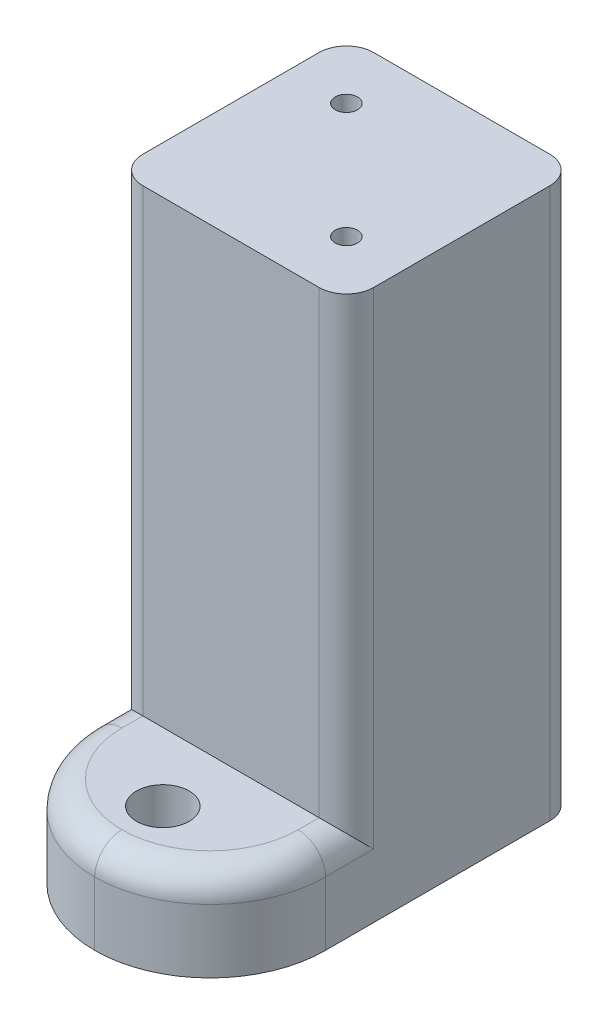
ISO-10303-21;
HEADER;
FILE_DESCRIPTION(('STEP AP214'),'2;1');
FILE_NAME('part.step','',(''),(''),'','','');
FILE_SCHEMA(('AUTOMOTIVE_DESIGN { 1 0 10303 214 1 1 1 1 }'));
ENDSEC;
DATA;
#1=APPLICATION_CONTEXT('core data for automotive mechanical design processes');
#2=APPLICATION_PROTOCOL_DEFINITION('international standard','automotive_design',2000,#1);
#3=PRODUCT_CONTEXT('',#1,'mechanical');
#4=PRODUCT('Part','Part','',(#3));
#5=PRODUCT_RELATED_PRODUCT_CATEGORY('part','',(#4));
#6=PRODUCT_DEFINITION_FORMATION('','',#4);
#7=PRODUCT_DEFINITION_CONTEXT('part definition',#1,'design');
#8=PRODUCT_DEFINITION('design','',#6,#7);
#9=PRODUCT_DEFINITION_SHAPE('','',#8);
#10=(LENGTH_UNIT() NAMED_UNIT(*) SI_UNIT(.MILLI.,.METRE.));
#11=(NAMED_UNIT(*) PLANE_ANGLE_UNIT() SI_UNIT($,.RADIAN.));
#12=(NAMED_UNIT(*) SI_UNIT($,.STERADIAN.) SOLID_ANGLE_UNIT());
#13=UNCERTAINTY_MEASURE_WITH_UNIT(LENGTH_MEASURE(1.E-05),#10,'distance_accuracy_value','');
#14=(GEOMETRIC_REPRESENTATION_CONTEXT(3) GLOBAL_UNCERTAINTY_ASSIGNED_CONTEXT((#13)) GLOBAL_UNIT_ASSIGNED_CONTEXT((#10,
#11,#12)) REPRESENTATION_CONTEXT('',''));
#15=CARTESIAN_POINT('',(0.,0.,0.));
#16=DIRECTION('',(0.,0.,1.));
#17=DIRECTION('',(1.,0.,0.));
#18=AXIS2_PLACEMENT_3D('',#15,#16,#17);
#19=CARTESIAN_POINT('',(0.,10.,0.));
#20=DIRECTION('',(0.,1.,0.));
#21=DIRECTION('',(0.,0.,1.));
#22=AXIS2_PLACEMENT_3D('',#19,#20,#21);
#23=PLANE('',#22);
#24=CARTESIAN_POINT('',(0.,10.,-7.5));
#25=DIRECTION('',(0.,1.,0.));
#26=DIRECTION('',(0.,0.,1.));
#27=AXIS2_PLACEMENT_3D('',#24,#25,#26);
#28=CIRCLE('',#27,2.9);
#29=CARTESIAN_POINT('',(0.,10.,-4.6));
#30=VERTEX_POINT('',#29);
#31=EDGE_CURVE('E205',#30,#30,#28,.T.);
#32=ORIENTED_EDGE('',*,*,#31,.F.);
#33=EDGE_LOOP('',(#32));
#34=FACE_BOUND('',#33,.T.);
#35=CARTESIAN_POINT('',(0.,10.,-12.7));
#36=DIRECTION('',(0.,1.,0.));
#37=DIRECTION('',(0.,0.,1.));
#38=AXIS2_PLACEMENT_3D('',#35,#36,#37);
#39=CIRCLE('',#38,9.7);
#40=CARTESIAN_POINT('',(0.,10.,-3.));
#41=VERTEX_POINT('',#40);
#42=CARTESIAN_POINT('',(-9.7,10.,-12.7));
#43=VERTEX_POINT('',#42);
#44=EDGE_CURVE('E208',#41,#43,#39,.F.);
#45=ORIENTED_EDGE('',*,*,#44,.F.);
#46=CARTESIAN_POINT('',(0.,10.,-12.7));
#47=DIRECTION('',(0.,1.,0.));
#48=DIRECTION('',(0.,0.,1.));
#49=AXIS2_PLACEMENT_3D('',#46,#47,#48);
#50=CIRCLE('',#49,9.7);
#51=CARTESIAN_POINT('',(9.7,10.,-12.7));
#52=VERTEX_POINT('',#51);
#53=EDGE_CURVE('E201',#52,#41,#50,.F.);
#54=ORIENTED_EDGE('',*,*,#53,.F.);
#55=DIRECTION('',(0.,0.,-1.));
#56=VECTOR('',#55,1.);
#57=CARTESIAN_POINT('',(9.7,10.,-15.));
#58=LINE('',#57,#56);
#59=CARTESIAN_POINT('',(9.7,10.,-15.));
#60=VERTEX_POINT('',#59);
#61=EDGE_CURVE('E150',#52,#60,#58,.T.);
#62=ORIENTED_EDGE('',*,*,#61,.T.);
#63=DIRECTION('',(1.,0.,0.));
#64=VECTOR('',#63,1.);
#65=CARTESIAN_POINT('',(-12.7,10.,-15.));
#66=LINE('',#65,#64);
#67=CARTESIAN_POINT('',(-9.7,10.,-15.));
#68=VERTEX_POINT('',#67);
#69=EDGE_CURVE('E133',#68,#60,#66,.T.);
#70=ORIENTED_EDGE('',*,*,#69,.F.);
#71=DIRECTION('',(0.,0.,1.));
#72=VECTOR('',#71,1.);
#73=CARTESIAN_POINT('',(-9.70000000000001,10.,0.));
#74=LINE('',#73,#72);
#75=EDGE_CURVE('E147',#68,#43,#74,.T.);
#76=ORIENTED_EDGE('',*,*,#75,.T.);
#77=EDGE_LOOP('',(#45,#54,#62,#70,#76));
#78=FACE_BOUND('',#77,.T.);
#79=ADVANCED_FACE('F35',(#34,#78),#23,.T.);
#80=CARTESIAN_POINT('',(-12.7,10.,-40.4));
#81=DIRECTION('',(1.,0.,0.));
#82=DIRECTION('',(0.,0.,-1.));
#83=AXIS2_PLACEMENT_3D('',#80,#81,#82);
#84=PLANE('',#83);
#85=DIRECTION('',(0.,0.,1.));
#86=VECTOR('',#85,1.);
#87=CARTESIAN_POINT('',(-12.7,0.,-40.4));
#88=LINE('',#87,#86);
#89=CARTESIAN_POINT('',(-12.7,0.,-37.4));
#90=VERTEX_POINT('',#89);
#91=CARTESIAN_POINT('',(-12.7,0.,-12.7));
#92=VERTEX_POINT('',#91);
#93=EDGE_CURVE('E254',#90,#92,#88,.T.);
#94=ORIENTED_EDGE('',*,*,#93,.T.);
#95=DIRECTION('',(0.,-1.,0.));
#96=VECTOR('',#95,1.);
#97=CARTESIAN_POINT('',(-12.7,10.,-12.7));
#98=LINE('',#97,#96);
#99=CARTESIAN_POINT('',(-12.7,7.,-12.7));
#100=VERTEX_POINT('',#99);
#101=EDGE_CURVE('E44',#92,#100,#98,.F.);
#102=ORIENTED_EDGE('',*,*,#101,.T.);
#103=DIRECTION('',(0.,0.,1.));
#104=VECTOR('',#103,1.);
#105=CARTESIAN_POINT('',(-12.7,7.,-15.));
#106=LINE('',#105,#104);
#107=CARTESIAN_POINT('',(-12.7,7.,-18.));
#108=VERTEX_POINT('',#107);
#109=EDGE_CURVE('E167',#100,#108,#106,.F.);
#110=ORIENTED_EDGE('',*,*,#109,.T.);
#111=DIRECTION('',(0.,-1.,0.));
#112=VECTOR('',#111,1.);
#113=CARTESIAN_POINT('',(-12.7,10.,-18.));
#114=LINE('',#113,#112);
#115=CARTESIAN_POINT('',(-12.7,60.54,-18.));
#116=VERTEX_POINT('',#115);
#117=EDGE_CURVE('E158',#108,#116,#114,.F.);
#118=ORIENTED_EDGE('',*,*,#117,.T.);
#119=DIRECTION('',(0.,0.,1.));
#120=VECTOR('',#119,1.);
#121=CARTESIAN_POINT('',(-12.7,60.54,-40.4));
#122=LINE('',#121,#120);
#123=CARTESIAN_POINT('',(-12.7,60.54,-37.4));
#124=VERTEX_POINT('',#123);
#125=EDGE_CURVE('E151',#124,#116,#122,.T.);
#126=ORIENTED_EDGE('',*,*,#125,.F.);
#127=DIRECTION('',(0.,-1.,0.));
#128=VECTOR('',#127,1.);
#129=CARTESIAN_POINT('',(-12.7,10.,-37.4));
#130=LINE('',#129,#128);
#131=EDGE_CURVE('E174',#124,#90,#130,.T.);
#132=ORIENTED_EDGE('',*,*,#131,.T.);
#133=EDGE_LOOP('',(#94,#102,#110,#118,#126,#132));
#134=FACE_BOUND('',#133,.T.);
#135=ADVANCED_FACE('F271',(#134),#84,.F.);
#136=CARTESIAN_POINT('',(12.7,10.,-40.4));
#137=DIRECTION('',(-1.,0.,0.));
#138=DIRECTION('',(0.,0.,1.));
#139=AXIS2_PLACEMENT_3D('',#136,#137,#138);
#140=PLANE('',#139);
#141=DIRECTION('',(0.,0.,-1.));
#142=VECTOR('',#141,1.);
#143=CARTESIAN_POINT('',(12.7,7.,0.));
#144=LINE('',#143,#142);
#145=CARTESIAN_POINT('',(12.7,7.,-18.));
#146=VERTEX_POINT('',#145);
#147=CARTESIAN_POINT('',(12.7,7.,-12.7));
#148=VERTEX_POINT('',#147);
#149=EDGE_CURVE('E179',#146,#148,#144,.F.);
#150=ORIENTED_EDGE('',*,*,#149,.T.);
#151=DIRECTION('',(0.,-1.,0.));
#152=VECTOR('',#151,1.);
#153=CARTESIAN_POINT('',(12.7,10.,-12.7));
#154=LINE('',#153,#152);
#155=CARTESIAN_POINT('',(12.7,0.,-12.7));
#156=VERTEX_POINT('',#155);
#157=EDGE_CURVE('E213',#148,#156,#154,.T.);
#158=ORIENTED_EDGE('',*,*,#157,.T.);
#159=DIRECTION('',(0.,0.,-1.));
#160=VECTOR('',#159,1.);
#161=CARTESIAN_POINT('',(12.7,0.,-40.4));
#162=LINE('',#161,#160);
#163=CARTESIAN_POINT('',(12.7,0.,-37.4));
#164=VERTEX_POINT('',#163);
#165=EDGE_CURVE('E257',#156,#164,#162,.T.);
#166=ORIENTED_EDGE('',*,*,#165,.T.);
#167=DIRECTION('',(0.,-1.,0.));
#168=VECTOR('',#167,1.);
#169=CARTESIAN_POINT('',(12.7,10.,-37.4));
#170=LINE('',#169,#168);
#171=CARTESIAN_POINT('',(12.7,60.54,-37.4));
#172=VERTEX_POINT('',#171);
#173=EDGE_CURVE('E182',#164,#172,#170,.F.);
#174=ORIENTED_EDGE('',*,*,#173,.T.);
#175=DIRECTION('',(0.,0.,-1.));
#176=VECTOR('',#175,1.);
#177=CARTESIAN_POINT('',(12.7,60.54,-40.4));
#178=LINE('',#177,#176);
#179=CARTESIAN_POINT('',(12.7,60.54,-18.));
#180=VERTEX_POINT('',#179);
#181=EDGE_CURVE('E247',#180,#172,#178,.T.);
#182=ORIENTED_EDGE('',*,*,#181,.F.);
#183=DIRECTION('',(0.,-1.,0.));
#184=VECTOR('',#183,1.);
#185=CARTESIAN_POINT('',(12.7,10.,-18.));
#186=LINE('',#185,#184);
#187=EDGE_CURVE('E177',#180,#146,#186,.T.);
#188=ORIENTED_EDGE('',*,*,#187,.T.);
#189=EDGE_LOOP('',(#150,#158,#166,#174,#182,#188));
#190=FACE_BOUND('',#189,.T.);
#191=ADVANCED_FACE('F288',(#190),#140,.F.);
#192=CARTESIAN_POINT('',(-12.7,10.,-40.4));
#193=DIRECTION('',(0.,0.,1.));
#194=DIRECTION('',(1.,0.,0.));
#195=AXIS2_PLACEMENT_3D('',#192,#193,#194);
#196=PLANE('',#195);
#197=DIRECTION('',(-1.,0.,0.));
#198=VECTOR('',#197,1.);
#199=CARTESIAN_POINT('',(-12.7,0.,-40.4));
#200=LINE('',#199,#198);
#201=CARTESIAN_POINT('',(9.7,0.,-40.4));
#202=VERTEX_POINT('',#201);
#203=CARTESIAN_POINT('',(-9.7,0.,-40.4));
#204=VERTEX_POINT('',#203);
#205=EDGE_CURVE('E169',#202,#204,#200,.T.);
#206=ORIENTED_EDGE('',*,*,#205,.T.);
#207=DIRECTION('',(0.,-1.,0.));
#208=VECTOR('',#207,1.);
#209=CARTESIAN_POINT('',(-9.7,10.,-40.4));
#210=LINE('',#209,#208);
#211=CARTESIAN_POINT('',(-9.7,60.54,-40.4));
#212=VERTEX_POINT('',#211);
#213=EDGE_CURVE('E192',#204,#212,#210,.F.);
#214=ORIENTED_EDGE('',*,*,#213,.T.);
#215=DIRECTION('',(-1.,0.,0.));
#216=VECTOR('',#215,1.);
#217=CARTESIAN_POINT('',(-12.7,60.54,-40.4));
#218=LINE('',#217,#216);
#219=CARTESIAN_POINT('',(9.7,60.54,-40.4));
#220=VERTEX_POINT('',#219);
#221=EDGE_CURVE('E249',#220,#212,#218,.T.);
#222=ORIENTED_EDGE('',*,*,#221,.F.);
#223=DIRECTION('',(0.,-1.,0.));
#224=VECTOR('',#223,1.);
#225=CARTESIAN_POINT('',(9.7,10.,-40.4));
#226=LINE('',#225,#224);
#227=EDGE_CURVE('E189',#220,#202,#226,.T.);
#228=ORIENTED_EDGE('',*,*,#227,.T.);
#229=EDGE_LOOP('',(#206,#214,#222,#228));
#230=FACE_BOUND('',#229,.T.);
#231=ADVANCED_FACE('F262',(#230),#196,.F.);
#232=CARTESIAN_POINT('',(0.,0.,0.));
#233=DIRECTION('',(0.,1.,0.));
#234=DIRECTION('',(0.,0.,1.));
#235=AXIS2_PLACEMENT_3D('',#232,#233,#234);
#236=PLANE('',#235);
#237=CARTESIAN_POINT('',(0.,0.,-7.5));
#238=DIRECTION('',(0.,1.,0.));
#239=DIRECTION('',(0.,0.,1.));
#240=AXIS2_PLACEMENT_3D('',#237,#238,#239);
#241=CIRCLE('',#240,2.9);
#242=CARTESIAN_POINT('',(0.,0.,-4.6));
#243=VERTEX_POINT('',#242);
#244=EDGE_CURVE('E486',#243,#243,#241,.T.);
#245=ORIENTED_EDGE('',*,*,#244,.T.);
#246=EDGE_LOOP('',(#245));
#247=FACE_BOUND('',#246,.T.);
#248=ORIENTED_EDGE('',*,*,#165,.F.);
#249=CARTESIAN_POINT('',(0.,0.,-12.7));
#250=DIRECTION('',(0.,1.,0.));
#251=DIRECTION('',(0.,0.,1.));
#252=AXIS2_PLACEMENT_3D('',#249,#250,#251);
#253=CIRCLE('',#252,12.7);
#254=CARTESIAN_POINT('',(0.,0.,0.));
#255=VERTEX_POINT('',#254);
#256=EDGE_CURVE('E52',#156,#255,#253,.F.);
#257=ORIENTED_EDGE('',*,*,#256,.T.);
#258=CARTESIAN_POINT('',(0.,0.,-12.7));
#259=DIRECTION('',(0.,1.,0.));
#260=DIRECTION('',(0.,0.,1.));
#261=AXIS2_PLACEMENT_3D('',#258,#259,#260);
#262=CIRCLE('',#261,12.7);
#263=EDGE_CURVE('E57',#255,#92,#262,.F.);
#264=ORIENTED_EDGE('',*,*,#263,.T.);
#265=ORIENTED_EDGE('',*,*,#93,.F.);
#266=CARTESIAN_POINT('',(-9.7,0.,-37.4));
#267=DIRECTION('',(0.,1.,0.));
#268=DIRECTION('',(0.,0.,1.));
#269=AXIS2_PLACEMENT_3D('',#266,#267,#268);
#270=CIRCLE('',#269,3.);
#271=EDGE_CURVE('E187',#90,#204,#270,.F.);
#272=ORIENTED_EDGE('',*,*,#271,.T.);
#273=ORIENTED_EDGE('',*,*,#205,.F.);
#274=CARTESIAN_POINT('',(9.7,0.,-37.4));
#275=DIRECTION('',(0.,1.,0.));
#276=DIRECTION('',(0.,0.,1.));
#277=AXIS2_PLACEMENT_3D('',#274,#275,#276);
#278=CIRCLE('',#277,3.);
#279=EDGE_CURVE('E184',#202,#164,#278,.F.);
#280=ORIENTED_EDGE('',*,*,#279,.T.);
#281=EDGE_LOOP('',(#248,#257,#264,#265,#272,#273,#280));
#282=FACE_BOUND('',#281,.T.);
#283=ADVANCED_FACE('F294',(#247,#282),#236,.F.);
#284=CARTESIAN_POINT('',(-12.7,60.54,-15.));
#285=DIRECTION('',(0.,0.,-1.));
#286=DIRECTION('',(-1.,0.,0.));
#287=AXIS2_PLACEMENT_3D('',#284,#285,#286);
#288=PLANE('',#287);
#289=ORIENTED_EDGE('',*,*,#69,.T.);
#290=DIRECTION('',(0.,-1.,0.));
#291=VECTOR('',#290,1.);
#292=CARTESIAN_POINT('',(9.7,60.54,-15.));
#293=LINE('',#292,#291);
#294=CARTESIAN_POINT('',(9.7,60.54,-15.));
#295=VERTEX_POINT('',#294);
#296=EDGE_CURVE('E140',#60,#295,#293,.F.);
#297=ORIENTED_EDGE('',*,*,#296,.T.);
#298=DIRECTION('',(1.,0.,0.));
#299=VECTOR('',#298,1.);
#300=CARTESIAN_POINT('',(-12.7,60.54,-15.));
#301=LINE('',#300,#299);
#302=CARTESIAN_POINT('',(-9.7,60.54,-15.));
#303=VERTEX_POINT('',#302);
#304=EDGE_CURVE('E136',#303,#295,#301,.T.);
#305=ORIENTED_EDGE('',*,*,#304,.F.);
#306=DIRECTION('',(0.,-1.,0.));
#307=VECTOR('',#306,1.);
#308=CARTESIAN_POINT('',(-9.7,60.54,-15.));
#309=LINE('',#308,#307);
#310=EDGE_CURVE('E130',#303,#68,#309,.T.);
#311=ORIENTED_EDGE('',*,*,#310,.T.);
#312=EDGE_LOOP('',(#289,#297,#305,#311));
#313=FACE_BOUND('',#312,.T.);
#314=ADVANCED_FACE('F132',(#313),#288,.F.);
#315=CARTESIAN_POINT('',(0.,60.54,0.));
#316=DIRECTION('',(0.,1.,0.));
#317=DIRECTION('',(0.,0.,1.));
#318=AXIS2_PLACEMENT_3D('',#315,#316,#317);
#319=PLANE('',#318);
#320=CARTESIAN_POINT('',(-6.35,60.54,-34.05));
#321=DIRECTION('',(0.,1.,0.));
#322=DIRECTION('',(0.,0.,1.));
#323=AXIS2_PLACEMENT_3D('',#320,#321,#322);
#324=CIRCLE('',#323,1.2303);
#325=CARTESIAN_POINT('',(-6.35,60.54,-32.8197));
#326=VERTEX_POINT('',#325);
#327=EDGE_CURVE('E480',#326,#326,#324,.T.);
#328=ORIENTED_EDGE('',*,*,#327,.F.);
#329=EDGE_LOOP('',(#328));
#330=FACE_BOUND('',#329,.T.);
#331=CARTESIAN_POINT('',(6.35,60.54,-21.35));
#332=DIRECTION('',(0.,1.,0.));
#333=DIRECTION('',(0.,0.,1.));
#334=AXIS2_PLACEMENT_3D('',#331,#332,#333);
#335=CIRCLE('',#334,1.2303);
#336=CARTESIAN_POINT('',(6.35,60.54,-20.1197));
#337=VERTEX_POINT('',#336);
#338=EDGE_CURVE('E483',#337,#337,#335,.T.);
#339=ORIENTED_EDGE('',*,*,#338,.F.);
#340=EDGE_LOOP('',(#339));
#341=FACE_BOUND('',#340,.T.);
#342=ORIENTED_EDGE('',*,*,#221,.T.);
#343=CARTESIAN_POINT('',(-9.7,60.54,-37.4));
#344=DIRECTION('',(0.,1.,0.));
#345=DIRECTION('',(0.,0.,1.));
#346=AXIS2_PLACEMENT_3D('',#343,#344,#345);
#347=CIRCLE('',#346,3.);
#348=EDGE_CURVE('E141',#212,#124,#347,.T.);
#349=ORIENTED_EDGE('',*,*,#348,.T.);
#350=ORIENTED_EDGE('',*,*,#125,.T.);
#351=CARTESIAN_POINT('',(-9.7,60.54,-18.));
#352=DIRECTION('',(0.,1.,0.));
#353=DIRECTION('',(0.,0.,1.));
#354=AXIS2_PLACEMENT_3D('',#351,#352,#353);
#355=CIRCLE('',#354,3.);
#356=EDGE_CURVE('E194',#116,#303,#355,.T.);
#357=ORIENTED_EDGE('',*,*,#356,.T.);
#358=ORIENTED_EDGE('',*,*,#304,.T.);
#359=CARTESIAN_POINT('',(9.7,60.54,-18.));
#360=DIRECTION('',(0.,1.,0.));
#361=DIRECTION('',(0.,0.,1.));
#362=AXIS2_PLACEMENT_3D('',#359,#360,#361);
#363=CIRCLE('',#362,3.);
#364=EDGE_CURVE('E196',#295,#180,#363,.T.);
#365=ORIENTED_EDGE('',*,*,#364,.T.);
#366=ORIENTED_EDGE('',*,*,#181,.T.);
#367=CARTESIAN_POINT('',(9.7,60.54,-37.4));
#368=DIRECTION('',(0.,1.,0.));
#369=DIRECTION('',(0.,0.,1.));
#370=AXIS2_PLACEMENT_3D('',#367,#368,#369);
#371=CIRCLE('',#370,3.);
#372=EDGE_CURVE('E198',#172,#220,#371,.T.);
#373=ORIENTED_EDGE('',*,*,#372,.T.);
#374=EDGE_LOOP('',(#342,#349,#350,#357,#358,#365,#366,#373));
#375=FACE_BOUND('',#374,.T.);
#376=ADVANCED_FACE('F243',(#330,#341,#375),#319,.T.);
#377=CARTESIAN_POINT('',(6.35,40.54,-21.35));
#378=DIRECTION('',(0.,1.,0.));
#379=DIRECTION('',(0.,0.,1.));
#380=AXIS2_PLACEMENT_3D('',#377,#378,#379);
#381=CYLINDRICAL_SURFACE('',#380,1.2303);
#382=CARTESIAN_POINT('',(6.35,40.54,-21.35));
#383=DIRECTION('',(0.,1.,0.));
#384=DIRECTION('',(0.,0.,1.));
#385=AXIS2_PLACEMENT_3D('',#382,#383,#384);
#386=CIRCLE('',#385,1.2303);
#387=CARTESIAN_POINT('',(6.35,40.54,-20.1197));
#388=VERTEX_POINT('',#387);
#389=EDGE_CURVE('E485',#388,#388,#386,.T.);
#390=ORIENTED_EDGE('',*,*,#389,.F.);
#391=EDGE_LOOP('',(#390));
#392=FACE_BOUND('',#391,.T.);
#393=ORIENTED_EDGE('',*,*,#338,.T.);
#394=EDGE_LOOP('',(#393));
#395=FACE_BOUND('',#394,.T.);
#396=ADVANCED_FACE('F414',(#392,#395),#381,.F.);
#397=CARTESIAN_POINT('',(6.35,40.54,-21.35));
#398=DIRECTION('',(0.,1.,0.));
#399=DIRECTION('',(0.,0.,1.));
#400=AXIS2_PLACEMENT_3D('',#397,#398,#399);
#401=PLANE('',#400);
#402=ORIENTED_EDGE('',*,*,#389,.T.);
#403=EDGE_LOOP('',(#402));
#404=FACE_BOUND('',#403,.T.);
#405=ADVANCED_FACE('F405',(#404),#401,.T.);
#406=CARTESIAN_POINT('',(-6.35,40.54,-34.05));
#407=DIRECTION('',(0.,1.,0.));
#408=DIRECTION('',(0.,0.,1.));
#409=AXIS2_PLACEMENT_3D('',#406,#407,#408);
#410=CYLINDRICAL_SURFACE('',#409,1.2303);
#411=CARTESIAN_POINT('',(-6.35,40.54,-34.05));
#412=DIRECTION('',(0.,1.,0.));
#413=DIRECTION('',(0.,0.,1.));
#414=AXIS2_PLACEMENT_3D('',#411,#412,#413);
#415=CIRCLE('',#414,1.2303);
#416=CARTESIAN_POINT('',(-6.35,40.54,-32.8197));
#417=VERTEX_POINT('',#416);
#418=EDGE_CURVE('E152',#417,#417,#415,.T.);
#419=ORIENTED_EDGE('',*,*,#418,.F.);
#420=EDGE_LOOP('',(#419));
#421=FACE_BOUND('',#420,.T.);
#422=ORIENTED_EDGE('',*,*,#327,.T.);
#423=EDGE_LOOP('',(#422));
#424=FACE_BOUND('',#423,.T.);
#425=ADVANCED_FACE('F396',(#421,#424),#410,.F.);
#426=CARTESIAN_POINT('',(-6.35,40.54,-34.05));
#427=DIRECTION('',(0.,1.,0.));
#428=DIRECTION('',(0.,0.,1.));
#429=AXIS2_PLACEMENT_3D('',#426,#427,#428);
#430=PLANE('',#429);
#431=ORIENTED_EDGE('',*,*,#418,.T.);
#432=EDGE_LOOP('',(#431));
#433=FACE_BOUND('',#432,.T.);
#434=ADVANCED_FACE('F387',(#433),#430,.T.);
#435=CARTESIAN_POINT('',(0.,0.,-7.5));
#436=DIRECTION('',(0.,1.,0.));
#437=DIRECTION('',(0.,0.,1.));
#438=AXIS2_PLACEMENT_3D('',#435,#436,#437);
#439=CYLINDRICAL_SURFACE('',#438,2.9);
#440=ORIENTED_EDGE('',*,*,#244,.F.);
#441=EDGE_LOOP('',(#440));
#442=FACE_BOUND('',#441,.T.);
#443=ORIENTED_EDGE('',*,*,#31,.T.);
#444=EDGE_LOOP('',(#443));
#445=FACE_BOUND('',#444,.T.);
#446=ADVANCED_FACE('F311',(#442,#445),#439,.F.);
#447=CARTESIAN_POINT('',(9.7,10.,-18.));
#448=DIRECTION('',(0.,-1.,0.));
#449=DIRECTION('',(0.,0.,-1.));
#450=AXIS2_PLACEMENT_3D('',#447,#448,#449);
#451=CYLINDRICAL_SURFACE('',#450,3.);
#452=ORIENTED_EDGE('',*,*,#364,.F.);
#453=ORIENTED_EDGE('',*,*,#296,.F.);
#454=CARTESIAN_POINT('',(9.7,7.,-18.));
#455=DIRECTION('',(0.,-0.707106781186547,0.707106781186547));
#456=DIRECTION('',(0.,0.707106781186547,0.707106781186547));
#457=AXIS2_PLACEMENT_3D('',#454,#455,#456);
#458=ELLIPSE('',#457,4.24264068711928,3.);
#459=EDGE_CURVE('E161',#146,#60,#458,.T.);
#460=ORIENTED_EDGE('',*,*,#459,.F.);
#461=ORIENTED_EDGE('',*,*,#187,.F.);
#462=EDGE_LOOP('',(#452,#453,#460,#461));
#463=FACE_BOUND('',#462,.T.);
#464=ADVANCED_FACE('F240',(#463),#451,.T.);
#465=CARTESIAN_POINT('',(9.70000000000001,7.,0.));
#466=DIRECTION('',(0.,0.,1.));
#467=DIRECTION('',(1.,0.,0.));
#468=AXIS2_PLACEMENT_3D('',#465,#466,#467);
#469=CYLINDRICAL_SURFACE('',#468,3.);
#470=ORIENTED_EDGE('',*,*,#61,.F.);
#471=CARTESIAN_POINT('',(9.7,7.,-12.7));
#472=DIRECTION('',(0.,0.,-1.));
#473=DIRECTION('',(-1.,0.,0.));
#474=AXIS2_PLACEMENT_3D('',#471,#472,#473);
#475=CIRCLE('',#474,3.);
#476=EDGE_CURVE('E210',#52,#148,#475,.T.);
#477=ORIENTED_EDGE('',*,*,#476,.T.);
#478=ORIENTED_EDGE('',*,*,#149,.F.);
#479=ORIENTED_EDGE('',*,*,#459,.T.);
#480=EDGE_LOOP('',(#470,#477,#478,#479));
#481=FACE_BOUND('',#480,.T.);
#482=ADVANCED_FACE('F234',(#481),#469,.T.);
#483=CARTESIAN_POINT('',(-9.7,60.54,-18.));
#484=DIRECTION('',(0.,-1.,0.));
#485=DIRECTION('',(0.,0.,-1.));
#486=AXIS2_PLACEMENT_3D('',#483,#484,#485);
#487=CYLINDRICAL_SURFACE('',#486,3.);
#488=ORIENTED_EDGE('',*,*,#356,.F.);
#489=ORIENTED_EDGE('',*,*,#117,.F.);
#490=CARTESIAN_POINT('',(-9.7,7.,-18.));
#491=DIRECTION('',(0.,0.707106781186547,-0.707106781186547));
#492=DIRECTION('',(0.,-0.707106781186547,-0.707106781186547));
#493=AXIS2_PLACEMENT_3D('',#490,#491,#492);
#494=ELLIPSE('',#493,4.24264068711928,3.);
#495=EDGE_CURVE('E156',#68,#108,#494,.F.);
#496=ORIENTED_EDGE('',*,*,#495,.F.);
#497=ORIENTED_EDGE('',*,*,#310,.F.);
#498=EDGE_LOOP('',(#488,#489,#496,#497));
#499=FACE_BOUND('',#498,.T.);
#500=ADVANCED_FACE('F157',(#499),#487,.T.);
#501=CARTESIAN_POINT('',(-9.70000000000001,7.,0.));
#502=DIRECTION('',(0.,0.,-1.));
#503=DIRECTION('',(-1.,0.,0.));
#504=AXIS2_PLACEMENT_3D('',#501,#502,#503);
#505=CYLINDRICAL_SURFACE('',#504,3.);
#506=ORIENTED_EDGE('',*,*,#109,.F.);
#507=CARTESIAN_POINT('',(-9.7,7.,-12.7));
#508=DIRECTION('',(0.,0.,-1.));
#509=DIRECTION('',(-1.,0.,0.));
#510=AXIS2_PLACEMENT_3D('',#507,#508,#509);
#511=CIRCLE('',#510,3.);
#512=EDGE_CURVE('E165',#100,#43,#511,.T.);
#513=ORIENTED_EDGE('',*,*,#512,.T.);
#514=ORIENTED_EDGE('',*,*,#75,.F.);
#515=ORIENTED_EDGE('',*,*,#495,.T.);
#516=EDGE_LOOP('',(#506,#513,#514,#515));
#517=FACE_BOUND('',#516,.T.);
#518=ADVANCED_FACE('F163',(#517),#505,.T.);
#519=CARTESIAN_POINT('',(-9.7,10.,-37.4));
#520=DIRECTION('',(0.,-1.,0.));
#521=DIRECTION('',(0.,0.,-1.));
#522=AXIS2_PLACEMENT_3D('',#519,#520,#521);
#523=CYLINDRICAL_SURFACE('',#522,3.);
#524=ORIENTED_EDGE('',*,*,#348,.F.);
#525=ORIENTED_EDGE('',*,*,#213,.F.);
#526=ORIENTED_EDGE('',*,*,#271,.F.);
#527=ORIENTED_EDGE('',*,*,#131,.F.);
#528=EDGE_LOOP('',(#524,#525,#526,#527));
#529=FACE_BOUND('',#528,.T.);
#530=ADVANCED_FACE('F267',(#529),#523,.T.);
#531=CARTESIAN_POINT('',(9.7,10.,-37.4));
#532=DIRECTION('',(0.,-1.,0.));
#533=DIRECTION('',(0.,0.,-1.));
#534=AXIS2_PLACEMENT_3D('',#531,#532,#533);
#535=CYLINDRICAL_SURFACE('',#534,3.);
#536=ORIENTED_EDGE('',*,*,#372,.F.);
#537=ORIENTED_EDGE('',*,*,#173,.F.);
#538=ORIENTED_EDGE('',*,*,#279,.F.);
#539=ORIENTED_EDGE('',*,*,#227,.F.);
#540=EDGE_LOOP('',(#536,#537,#538,#539));
#541=FACE_BOUND('',#540,.T.);
#542=ADVANCED_FACE('F314',(#541),#535,.T.);
#543=CARTESIAN_POINT('',(0.,7.,-12.7));
#544=DIRECTION('',(0.,1.,0.));
#545=DIRECTION('',(0.,0.,1.));
#546=AXIS2_PLACEMENT_3D('',#543,#544,#545);
#547=TOROIDAL_SURFACE('',#546,9.7,3.);
#548=CARTESIAN_POINT('',(0.,7.,-12.7));
#549=DIRECTION('',(0.,1.,0.));
#550=DIRECTION('',(0.,0.,1.));
#551=AXIS2_PLACEMENT_3D('',#548,#549,#550);
#552=CIRCLE('',#551,12.7);
#553=CARTESIAN_POINT('',(0.,7.,0.));
#554=VERTEX_POINT('',#553);
#555=EDGE_CURVE('E39',#148,#554,#552,.F.);
#556=ORIENTED_EDGE('',*,*,#555,.F.);
#557=ORIENTED_EDGE('',*,*,#476,.F.);
#558=ORIENTED_EDGE('',*,*,#53,.T.);
#559=CARTESIAN_POINT('',(0.,7.,-3.));
#560=DIRECTION('',(1.,0.,0.));
#561=DIRECTION('',(0.,0.,-1.));
#562=AXIS2_PLACEMENT_3D('',#559,#560,#561);
#563=CIRCLE('',#562,3.);
#564=EDGE_CURVE('E11',#41,#554,#563,.T.);
#565=ORIENTED_EDGE('',*,*,#564,.T.);
#566=EDGE_LOOP('',(#556,#557,#558,#565));
#567=FACE_BOUND('',#566,.T.);
#568=ADVANCED_FACE('F37',(#567),#547,.T.);
#569=CARTESIAN_POINT('',(0.,10.,-12.7));
#570=DIRECTION('',(0.,-1.,0.));
#571=DIRECTION('',(0.,0.,-1.));
#572=AXIS2_PLACEMENT_3D('',#569,#570,#571);
#573=CYLINDRICAL_SURFACE('',#572,12.7);
#574=ORIENTED_EDGE('',*,*,#157,.F.);
#575=ORIENTED_EDGE('',*,*,#555,.T.);
#576=DIRECTION('',(0.,-1.,0.));
#577=VECTOR('',#576,1.);
#578=CARTESIAN_POINT('',(0.,10.,0.));
#579=LINE('',#578,#577);
#580=EDGE_CURVE('E220',#255,#554,#579,.F.);
#581=ORIENTED_EDGE('',*,*,#580,.F.);
#582=ORIENTED_EDGE('',*,*,#256,.F.);
#583=EDGE_LOOP('',(#574,#575,#581,#582));
#584=FACE_BOUND('',#583,.T.);
#585=ADVANCED_FACE('F228',(#584),#573,.T.);
#586=CARTESIAN_POINT('',(0.,10.,-12.7));
#587=DIRECTION('',(0.,-1.,0.));
#588=DIRECTION('',(0.,0.,-1.));
#589=AXIS2_PLACEMENT_3D('',#586,#587,#588);
#590=CYLINDRICAL_SURFACE('',#589,12.7);
#591=ORIENTED_EDGE('',*,*,#263,.F.);
#592=ORIENTED_EDGE('',*,*,#580,.T.);
#593=CARTESIAN_POINT('',(0.,7.,-12.7));
#594=DIRECTION('',(0.,1.,0.));
#595=DIRECTION('',(0.,0.,1.));
#596=AXIS2_PLACEMENT_3D('',#593,#594,#595);
#597=CIRCLE('',#596,12.7);
#598=EDGE_CURVE('E218',#100,#554,#597,.T.);
#599=ORIENTED_EDGE('',*,*,#598,.F.);
#600=ORIENTED_EDGE('',*,*,#101,.F.);
#601=EDGE_LOOP('',(#591,#592,#599,#600));
#602=FACE_BOUND('',#601,.T.);
#603=ADVANCED_FACE('F273',(#602),#590,.T.);
#604=CARTESIAN_POINT('',(0.,7.,-12.7));
#605=DIRECTION('',(0.,1.,0.));
#606=DIRECTION('',(0.,0.,1.));
#607=AXIS2_PLACEMENT_3D('',#604,#605,#606);
#608=TOROIDAL_SURFACE('',#607,9.7,3.);
#609=ORIENTED_EDGE('',*,*,#564,.F.);
#610=ORIENTED_EDGE('',*,*,#44,.T.);
#611=ORIENTED_EDGE('',*,*,#512,.F.);
#612=ORIENTED_EDGE('',*,*,#598,.T.);
#613=EDGE_LOOP('',(#609,#610,#611,#612));
#614=FACE_BOUND('',#613,.T.);
#615=ADVANCED_FACE('F232',(#614),#608,.T.);
#616=CLOSED_SHELL('',(#79,#135,#191,#231,#283,#314,#376,#396,#405,#425,#434,#446,#464,#482,#500,
#518,#530,#542,#568,#585,#603,#615));
#617=MANIFOLD_SOLID_BREP('B2',#616);
#618=ADVANCED_BREP_SHAPE_REPRESENTATION('',(#18,#617),#14);
#619=SHAPE_DEFINITION_REPRESENTATION(#9,#618);
ENDSEC;
END-ISO-10303-21;
